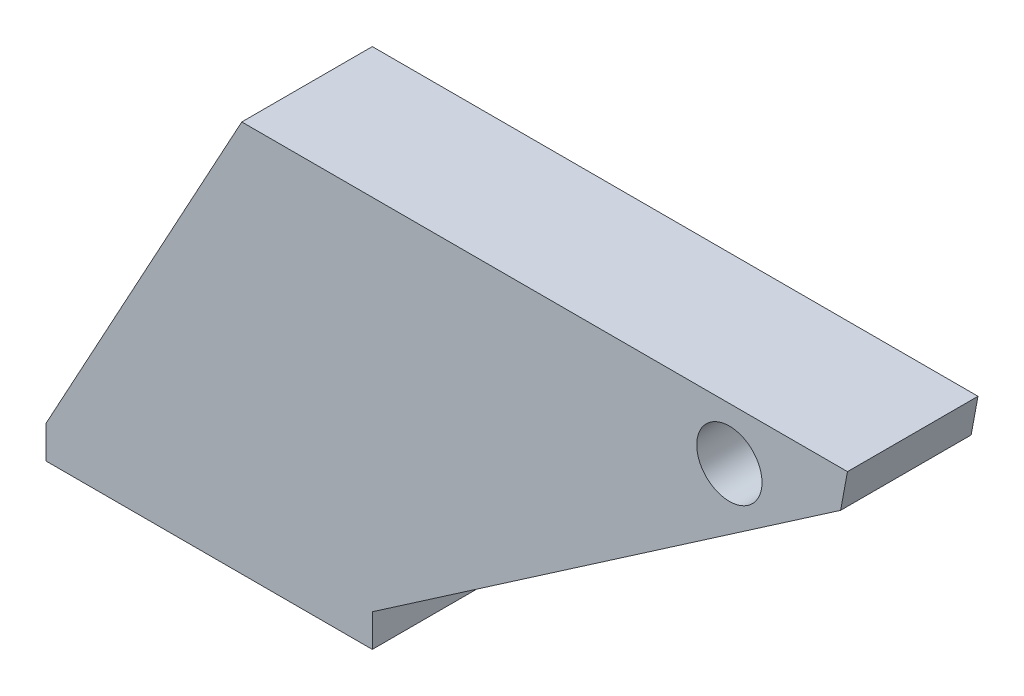
ISO-10303-21;
HEADER;
FILE_DESCRIPTION(('STEP AP214'),'2;1');
FILE_NAME('part.step','',(''),(''),'','','');
FILE_SCHEMA(('AUTOMOTIVE_DESIGN { 1 0 10303 214 1 1 1 1 }'));
ENDSEC;
DATA;
#1=APPLICATION_CONTEXT('core data for automotive mechanical design processes');
#2=APPLICATION_PROTOCOL_DEFINITION('international standard','automotive_design',2000,#1);
#3=PRODUCT_CONTEXT('',#1,'mechanical');
#4=PRODUCT('Part','Part','',(#3));
#5=PRODUCT_RELATED_PRODUCT_CATEGORY('part','',(#4));
#6=PRODUCT_DEFINITION_FORMATION('','',#4);
#7=PRODUCT_DEFINITION_CONTEXT('part definition',#1,'design');
#8=PRODUCT_DEFINITION('design','',#6,#7);
#9=PRODUCT_DEFINITION_SHAPE('','',#8);
#10=(LENGTH_UNIT() NAMED_UNIT(*) SI_UNIT(.MILLI.,.METRE.));
#11=(NAMED_UNIT(*) PLANE_ANGLE_UNIT() SI_UNIT($,.RADIAN.));
#12=(NAMED_UNIT(*) SI_UNIT($,.STERADIAN.) SOLID_ANGLE_UNIT());
#13=UNCERTAINTY_MEASURE_WITH_UNIT(LENGTH_MEASURE(1.E-05),#10,'distance_accuracy_value','');
#14=(GEOMETRIC_REPRESENTATION_CONTEXT(3) GLOBAL_UNCERTAINTY_ASSIGNED_CONTEXT((#13)) GLOBAL_UNIT_ASSIGNED_CONTEXT((#10,
#11,#12)) REPRESENTATION_CONTEXT('',''));
#15=CARTESIAN_POINT('',(0.,0.,0.));
#16=DIRECTION('',(0.,0.,1.));
#17=DIRECTION('',(1.,0.,0.));
#18=AXIS2_PLACEMENT_3D('',#15,#16,#17);
#19=CARTESIAN_POINT('',(0.,0.,20.));
#20=DIRECTION('',(0.,0.,1.));
#21=DIRECTION('',(1.,0.,0.));
#22=AXIS2_PLACEMENT_3D('',#19,#20,#21);
#23=PLANE('',#22);
#24=DIRECTION('',(0.824041924199368,0.566528822887065,0.));
#25=VECTOR('',#24,1.);
#26=CARTESIAN_POINT('',(-8.95411262883839,-2.00790655357494,20.));
#27=LINE('',#26,#25);
#28=CARTESIAN_POINT('',(-8.95411262883839,-2.00790655357494,20.));
#29=VERTEX_POINT('',#28);
#30=CARTESIAN_POINT('',(62.8054681291678,47.3268052175543,20.));
#31=VERTEX_POINT('',#30);
#32=EDGE_CURVE('E151',#29,#31,#27,.T.);
#33=ORIENTED_EDGE('',*,*,#32,.T.);
#34=DIRECTION('',(-0.182089260182311,-0.98328200498446,0.));
#35=VECTOR('',#34,1.);
#36=CARTESIAN_POINT('',(52.2494264745269,-9.67581971750518,20.));
#37=LINE('',#36,#35);
#38=CARTESIAN_POINT('',(63.8545955789587,52.9920934464251,20.));
#39=VERTEX_POINT('',#38);
#40=EDGE_CURVE('E11',#31,#39,#37,.F.);
#41=ORIENTED_EDGE('',*,*,#40,.T.);
#42=DIRECTION('',(-1.,0.,0.));
#43=VECTOR('',#42,1.);
#44=CARTESIAN_POINT('',(71.0458873711616,52.9920934464251,20.));
#45=LINE('',#44,#43);
#46=CARTESIAN_POINT('',(-28.9541126288384,52.9920934464251,20.));
#47=VERTEX_POINT('',#46);
#48=EDGE_CURVE('E115',#39,#47,#45,.T.);
#49=ORIENTED_EDGE('',*,*,#48,.T.);
#50=DIRECTION('',(-0.478852130680573,-0.877895572914384,0.));
#51=VECTOR('',#50,1.);
#52=CARTESIAN_POINT('',(-28.9541126288384,52.9920934464251,20.));
#53=LINE('',#52,#51);
#54=CARTESIAN_POINT('',(-58.9541126288384,-2.00790655357494,20.));
#55=VERTEX_POINT('',#54);
#56=EDGE_CURVE('E110',#47,#55,#53,.T.);
#57=ORIENTED_EDGE('',*,*,#56,.T.);
#58=DIRECTION('',(0.,-1.,0.));
#59=VECTOR('',#58,1.);
#60=CARTESIAN_POINT('',(-58.9541126288384,-2.00790655357494,20.));
#61=LINE('',#60,#59);
#62=CARTESIAN_POINT('',(-58.9541126288384,-7.00790655357494,20.));
#63=VERTEX_POINT('',#62);
#64=EDGE_CURVE('E99',#55,#63,#61,.T.);
#65=ORIENTED_EDGE('',*,*,#64,.T.);
#66=DIRECTION('',(1.,0.,0.));
#67=VECTOR('',#66,1.);
#68=CARTESIAN_POINT('',(-58.9541126288384,-7.00790655357494,20.));
#69=LINE('',#68,#67);
#70=CARTESIAN_POINT('',(-8.95411262883839,-7.00790655357494,20.));
#71=VERTEX_POINT('',#70);
#72=EDGE_CURVE('E109',#63,#71,#69,.T.);
#73=ORIENTED_EDGE('',*,*,#72,.T.);
#74=DIRECTION('',(0.,1.,0.));
#75=VECTOR('',#74,1.);
#76=CARTESIAN_POINT('',(-8.95411262883839,-7.00790655357494,20.));
#77=LINE('',#76,#75);
#78=EDGE_CURVE('E153',#71,#29,#77,.T.);
#79=ORIENTED_EDGE('',*,*,#78,.T.);
#80=EDGE_LOOP('',(#33,#41,#49,#57,#65,#73,#79));
#81=FACE_BOUND('',#80,.T.);
#82=CARTESIAN_POINT('',(45.7565856558177,44.9920934464251,20.));
#83=DIRECTION('',(0.,0.,1.));
#84=DIRECTION('',(1.,0.,0.));
#85=AXIS2_PLACEMENT_3D('',#82,#83,#84);
#86=CIRCLE('',#85,5.);
#87=CARTESIAN_POINT('',(50.7565856558177,44.9920934464251,20.));
#88=VERTEX_POINT('',#87);
#89=EDGE_CURVE('E149',#88,#88,#86,.T.);
#90=ORIENTED_EDGE('',*,*,#89,.F.);
#91=EDGE_LOOP('',(#90));
#92=FACE_BOUND('',#91,.T.);
#93=ADVANCED_FACE('F39',(#81,#92),#23,.T.);
#94=CARTESIAN_POINT('',(0.,0.,0.));
#95=DIRECTION('',(0.,0.,1.));
#96=DIRECTION('',(1.,0.,0.));
#97=AXIS2_PLACEMENT_3D('',#94,#95,#96);
#98=PLANE('',#97);
#99=DIRECTION('',(-1.,0.,0.));
#100=VECTOR('',#99,1.);
#101=CARTESIAN_POINT('',(71.0458873711616,52.9920934464251,0.));
#102=LINE('',#101,#100);
#103=CARTESIAN_POINT('',(63.8545955789587,52.9920934464251,0.));
#104=VERTEX_POINT('',#103);
#105=CARTESIAN_POINT('',(-28.9541126288384,52.9920934464251,0.));
#106=VERTEX_POINT('',#105);
#107=EDGE_CURVE('E119',#104,#106,#102,.T.);
#108=ORIENTED_EDGE('',*,*,#107,.F.);
#109=DIRECTION('',(0.182089260182311,0.98328200498446,0.));
#110=VECTOR('',#109,1.);
#111=CARTESIAN_POINT('',(63.8545955789587,52.9920934464251,0.));
#112=LINE('',#111,#110);
#113=CARTESIAN_POINT('',(62.8054681291678,47.3268052175543,0.));
#114=VERTEX_POINT('',#113);
#115=EDGE_CURVE('E62',#104,#114,#112,.F.);
#116=ORIENTED_EDGE('',*,*,#115,.T.);
#117=DIRECTION('',(0.824041924199368,0.566528822887065,0.));
#118=VECTOR('',#117,1.);
#119=CARTESIAN_POINT('',(-8.95411262883839,-2.00790655357494,0.));
#120=LINE('',#119,#118);
#121=CARTESIAN_POINT('',(-8.95411262883839,-2.00790655357494,0.));
#122=VERTEX_POINT('',#121);
#123=EDGE_CURVE('E140',#122,#114,#120,.T.);
#124=ORIENTED_EDGE('',*,*,#123,.F.);
#125=DIRECTION('',(0.,1.,0.));
#126=VECTOR('',#125,1.);
#127=CARTESIAN_POINT('',(-8.95411262883839,-7.00790655357494,0.));
#128=LINE('',#127,#126);
#129=CARTESIAN_POINT('',(-8.95411262883839,-7.00790655357494,0.));
#130=VERTEX_POINT('',#129);
#131=EDGE_CURVE('E142',#130,#122,#128,.T.);
#132=ORIENTED_EDGE('',*,*,#131,.F.);
#133=DIRECTION('',(1.,0.,0.));
#134=VECTOR('',#133,1.);
#135=CARTESIAN_POINT('',(-58.9541126288384,-7.00790655357494,0.));
#136=LINE('',#135,#134);
#137=CARTESIAN_POINT('',(-58.9541126288384,-7.00790655357494,0.));
#138=VERTEX_POINT('',#137);
#139=EDGE_CURVE('E144',#138,#130,#136,.T.);
#140=ORIENTED_EDGE('',*,*,#139,.F.);
#141=DIRECTION('',(0.,-1.,0.));
#142=VECTOR('',#141,1.);
#143=CARTESIAN_POINT('',(-58.9541126288384,-2.00790655357494,0.));
#144=LINE('',#143,#142);
#145=CARTESIAN_POINT('',(-58.9541126288384,-2.00790655357494,0.));
#146=VERTEX_POINT('',#145);
#147=EDGE_CURVE('E146',#146,#138,#144,.T.);
#148=ORIENTED_EDGE('',*,*,#147,.F.);
#149=DIRECTION('',(-0.478852130680573,-0.877895572914384,0.));
#150=VECTOR('',#149,1.);
#151=CARTESIAN_POINT('',(-28.9541126288384,52.9920934464251,0.));
#152=LINE('',#151,#150);
#153=EDGE_CURVE('E123',#106,#146,#152,.T.);
#154=ORIENTED_EDGE('',*,*,#153,.F.);
#155=EDGE_LOOP('',(#108,#116,#124,#132,#140,#148,#154));
#156=FACE_BOUND('',#155,.T.);
#157=CARTESIAN_POINT('',(45.7565856558177,44.9920934464251,0.));
#158=DIRECTION('',(0.,0.,1.));
#159=DIRECTION('',(1.,0.,0.));
#160=AXIS2_PLACEMENT_3D('',#157,#158,#159);
#161=CIRCLE('',#160,5.);
#162=CARTESIAN_POINT('',(50.7565856558177,44.9920934464251,0.));
#163=VERTEX_POINT('',#162);
#164=EDGE_CURVE('E156',#163,#163,#161,.T.);
#165=ORIENTED_EDGE('',*,*,#164,.T.);
#166=EDGE_LOOP('',(#165));
#167=FACE_BOUND('',#166,.T.);
#168=ADVANCED_FACE('F187',(#156,#167),#98,.F.);
#169=CARTESIAN_POINT('',(-28.9541126288384,52.9920934464251,20.));
#170=DIRECTION('',(0.877895572914385,-0.478852130680573,0.));
#171=DIRECTION('',(0.478852130680573,0.877895572914385,0.));
#172=AXIS2_PLACEMENT_3D('',#169,#170,#171);
#173=PLANE('',#172);
#174=ORIENTED_EDGE('',*,*,#153,.T.);
#175=DIRECTION('',(0.,0.,-1.));
#176=VECTOR('',#175,1.);
#177=CARTESIAN_POINT('',(-58.9541126288384,-2.00790655357494,20.));
#178=LINE('',#177,#176);
#179=EDGE_CURVE('E103',#55,#146,#178,.T.);
#180=ORIENTED_EDGE('',*,*,#179,.F.);
#181=ORIENTED_EDGE('',*,*,#56,.F.);
#182=DIRECTION('',(0.,0.,-1.));
#183=VECTOR('',#182,1.);
#184=CARTESIAN_POINT('',(-28.9541126288384,52.9920934464251,20.));
#185=LINE('',#184,#183);
#186=EDGE_CURVE('E137',#47,#106,#185,.T.);
#187=ORIENTED_EDGE('',*,*,#186,.T.);
#188=EDGE_LOOP('',(#174,#180,#181,#187));
#189=FACE_BOUND('',#188,.T.);
#190=ADVANCED_FACE('F121',(#189),#173,.F.);
#191=CARTESIAN_POINT('',(-58.9541126288384,-2.00790655357494,20.));
#192=DIRECTION('',(1.,0.,0.));
#193=DIRECTION('',(0.,1.,0.));
#194=AXIS2_PLACEMENT_3D('',#191,#192,#193);
#195=PLANE('',#194);
#196=ORIENTED_EDGE('',*,*,#147,.T.);
#197=DIRECTION('',(0.,0.,-1.));
#198=VECTOR('',#197,1.);
#199=CARTESIAN_POINT('',(-58.9541126288384,-7.00790655357494,20.));
#200=LINE('',#199,#198);
#201=EDGE_CURVE('E106',#63,#138,#200,.T.);
#202=ORIENTED_EDGE('',*,*,#201,.F.);
#203=ORIENTED_EDGE('',*,*,#64,.F.);
#204=ORIENTED_EDGE('',*,*,#179,.T.);
#205=EDGE_LOOP('',(#196,#202,#203,#204));
#206=FACE_BOUND('',#205,.T.);
#207=ADVANCED_FACE('F101',(#206),#195,.F.);
#208=CARTESIAN_POINT('',(-58.9541126288384,-7.00790655357494,20.));
#209=DIRECTION('',(0.,1.,0.));
#210=DIRECTION('',(-1.,0.,0.));
#211=AXIS2_PLACEMENT_3D('',#208,#209,#210);
#212=PLANE('',#211);
#213=CARTESIAN_POINT('',(-23.9541126288384,-7.00790655357494,10.));
#214=DIRECTION('',(0.,-1.,0.));
#215=DIRECTION('',(1.,0.,0.));
#216=AXIS2_PLACEMENT_3D('',#213,#214,#215);
#217=CIRCLE('',#216,5.);
#218=CARTESIAN_POINT('',(-18.9541126288384,-7.00790655357494,10.));
#219=VERTEX_POINT('',#218);
#220=EDGE_CURVE('E162',#219,#219,#217,.T.);
#221=ORIENTED_EDGE('',*,*,#220,.F.);
#222=EDGE_LOOP('',(#221));
#223=FACE_BOUND('',#222,.T.);
#224=ORIENTED_EDGE('',*,*,#139,.T.);
#225=DIRECTION('',(0.,0.,-1.));
#226=VECTOR('',#225,1.);
#227=CARTESIAN_POINT('',(-8.95411262883839,-7.00790655357494,20.));
#228=LINE('',#227,#226);
#229=EDGE_CURVE('E128',#71,#130,#228,.T.);
#230=ORIENTED_EDGE('',*,*,#229,.F.);
#231=ORIENTED_EDGE('',*,*,#72,.F.);
#232=ORIENTED_EDGE('',*,*,#201,.T.);
#233=EDGE_LOOP('',(#224,#230,#231,#232));
#234=FACE_BOUND('',#233,.T.);
#235=ADVANCED_FACE('F176',(#223,#234),#212,.F.);
#236=CARTESIAN_POINT('',(-8.95411262883839,-7.00790655357494,20.));
#237=DIRECTION('',(-1.,0.,0.));
#238=DIRECTION('',(0.,-1.,0.));
#239=AXIS2_PLACEMENT_3D('',#236,#237,#238);
#240=PLANE('',#239);
#241=ORIENTED_EDGE('',*,*,#131,.T.);
#242=DIRECTION('',(0.,0.,-1.));
#243=VECTOR('',#242,1.);
#244=CARTESIAN_POINT('',(-8.95411262883839,-2.00790655357494,20.));
#245=LINE('',#244,#243);
#246=EDGE_CURVE('E134',#29,#122,#245,.T.);
#247=ORIENTED_EDGE('',*,*,#246,.F.);
#248=ORIENTED_EDGE('',*,*,#78,.F.);
#249=ORIENTED_EDGE('',*,*,#229,.T.);
#250=EDGE_LOOP('',(#241,#247,#248,#249));
#251=FACE_BOUND('',#250,.T.);
#252=ADVANCED_FACE('F179',(#251),#240,.F.);
#253=CARTESIAN_POINT('',(-8.95411262883839,-2.00790655357494,20.));
#254=DIRECTION('',(-0.566528822887065,0.824041924199368,0.));
#255=DIRECTION('',(-0.824041924199368,-0.566528822887065,0.));
#256=AXIS2_PLACEMENT_3D('',#253,#254,#255);
#257=PLANE('',#256);
#258=ORIENTED_EDGE('',*,*,#123,.T.);
#259=DIRECTION('',(0.,0.,1.));
#260=VECTOR('',#259,1.);
#261=CARTESIAN_POINT('',(62.8054681291678,47.3268052175543,20.));
#262=LINE('',#261,#260);
#263=EDGE_CURVE('E48',#114,#31,#262,.T.);
#264=ORIENTED_EDGE('',*,*,#263,.T.);
#265=ORIENTED_EDGE('',*,*,#32,.F.);
#266=ORIENTED_EDGE('',*,*,#246,.T.);
#267=EDGE_LOOP('',(#258,#264,#265,#266));
#268=FACE_BOUND('',#267,.T.);
#269=ADVANCED_FACE('F189',(#268),#257,.F.);
#270=CARTESIAN_POINT('',(71.0458873711616,52.9920934464251,20.));
#271=DIRECTION('',(0.,-1.,0.));
#272=DIRECTION('',(1.,0.,0.));
#273=AXIS2_PLACEMENT_3D('',#270,#271,#272);
#274=PLANE('',#273);
#275=ORIENTED_EDGE('',*,*,#48,.F.);
#276=DIRECTION('',(0.,0.,-1.));
#277=VECTOR('',#276,1.);
#278=CARTESIAN_POINT('',(63.8545955789587,52.9920934464251,20.));
#279=LINE('',#278,#277);
#280=EDGE_CURVE('E124',#39,#104,#279,.T.);
#281=ORIENTED_EDGE('',*,*,#280,.T.);
#282=ORIENTED_EDGE('',*,*,#107,.T.);
#283=ORIENTED_EDGE('',*,*,#186,.F.);
#284=EDGE_LOOP('',(#275,#281,#282,#283));
#285=FACE_BOUND('',#284,.T.);
#286=ADVANCED_FACE('F194',(#285),#274,.F.);
#287=CARTESIAN_POINT('',(45.7565856558177,44.9920934464251,20.));
#288=DIRECTION('',(0.,0.,-1.));
#289=DIRECTION('',(-1.,0.,0.));
#290=AXIS2_PLACEMENT_3D('',#287,#288,#289);
#291=CYLINDRICAL_SURFACE('',#290,5.);
#292=ORIENTED_EDGE('',*,*,#89,.T.);
#293=EDGE_LOOP('',(#292));
#294=FACE_BOUND('',#293,.T.);
#295=ORIENTED_EDGE('',*,*,#164,.F.);
#296=EDGE_LOOP('',(#295));
#297=FACE_BOUND('',#296,.T.);
#298=ADVANCED_FACE('F196',(#294,#297),#291,.F.);
#299=CARTESIAN_POINT('',(63.8545955789587,52.9920934464251,20.));
#300=DIRECTION('',(-0.983282004984459,0.182089260182311,0.));
#301=DIRECTION('',(0.,0.,-1.));
#302=AXIS2_PLACEMENT_3D('',#299,#300,#301);
#303=PLANE('',#302);
#304=ORIENTED_EDGE('',*,*,#40,.F.);
#305=ORIENTED_EDGE('',*,*,#263,.F.);
#306=ORIENTED_EDGE('',*,*,#115,.F.);
#307=ORIENTED_EDGE('',*,*,#280,.F.);
#308=EDGE_LOOP('',(#304,#305,#306,#307));
#309=FACE_BOUND('',#308,.T.);
#310=ADVANCED_FACE('F42',(#309),#303,.F.);
#311=CARTESIAN_POINT('',(-23.9541126288384,2.99209344642506,10.));
#312=DIRECTION('',(0.,-1.,0.));
#313=DIRECTION('',(1.,0.,0.));
#314=AXIS2_PLACEMENT_3D('',#311,#312,#313);
#315=CYLINDRICAL_SURFACE('',#314,5.);
#316=CARTESIAN_POINT('',(-23.9541126288384,2.99209344642506,10.));
#317=DIRECTION('',(0.,-1.,0.));
#318=DIRECTION('',(1.,0.,0.));
#319=AXIS2_PLACEMENT_3D('',#316,#317,#318);
#320=CIRCLE('',#319,5.);
#321=CARTESIAN_POINT('',(-18.9541126288384,2.99209344642506,10.));
#322=VERTEX_POINT('',#321);
#323=EDGE_CURVE('E159',#322,#322,#320,.T.);
#324=ORIENTED_EDGE('',*,*,#323,.F.);
#325=EDGE_LOOP('',(#324));
#326=FACE_BOUND('',#325,.T.);
#327=ORIENTED_EDGE('',*,*,#220,.T.);
#328=EDGE_LOOP('',(#327));
#329=FACE_BOUND('',#328,.T.);
#330=ADVANCED_FACE('F170',(#326,#329),#315,.F.);
#331=CARTESIAN_POINT('',(-23.9541126288384,2.99209344642506,10.));
#332=DIRECTION('',(0.,-1.,0.));
#333=DIRECTION('',(1.,0.,0.));
#334=AXIS2_PLACEMENT_3D('',#331,#332,#333);
#335=PLANE('',#334);
#336=ORIENTED_EDGE('',*,*,#323,.T.);
#337=EDGE_LOOP('',(#336));
#338=FACE_BOUND('',#337,.T.);
#339=ADVANCED_FACE('F168',(#338),#335,.T.);
#340=CLOSED_SHELL('',(#93,#168,#190,#207,#235,#252,#269,#286,#298,#310,#330,#339));
#341=MANIFOLD_SOLID_BREP('B2',#340);
#342=ADVANCED_BREP_SHAPE_REPRESENTATION('',(#18,#341),#14);
#343=SHAPE_DEFINITION_REPRESENTATION(#9,#342);
ENDSEC;
END-ISO-10303-21;
